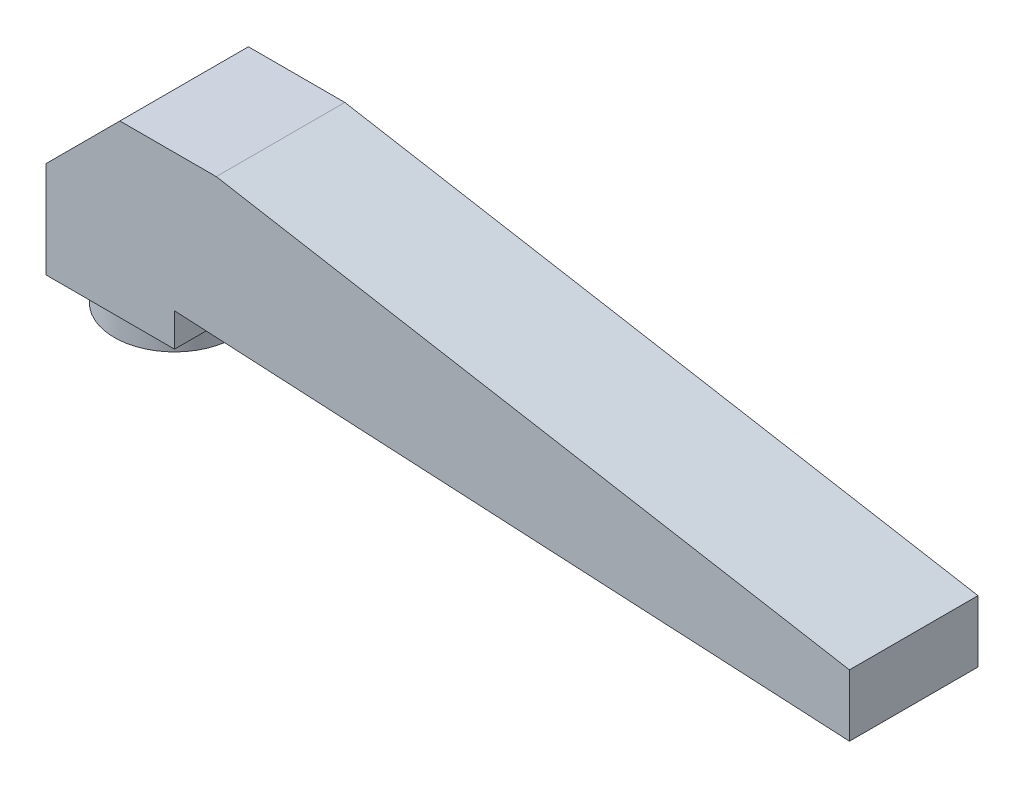
ISO-10303-21;
HEADER;
FILE_DESCRIPTION(('STEP AP214'),'2;1');
FILE_NAME('part.step','',(''),(''),'','','');
FILE_SCHEMA(('AUTOMOTIVE_DESIGN { 1 0 10303 214 1 1 1 1 }'));
ENDSEC;
DATA;
#1=APPLICATION_CONTEXT('core data for automotive mechanical design processes');
#2=APPLICATION_PROTOCOL_DEFINITION('international standard','automotive_design',2000,#1);
#3=PRODUCT_CONTEXT('',#1,'mechanical');
#4=PRODUCT('Part','Part','',(#3));
#5=PRODUCT_RELATED_PRODUCT_CATEGORY('part','',(#4));
#6=PRODUCT_DEFINITION_FORMATION('','',#4);
#7=PRODUCT_DEFINITION_CONTEXT('part definition',#1,'design');
#8=PRODUCT_DEFINITION('design','',#6,#7);
#9=PRODUCT_DEFINITION_SHAPE('','',#8);
#10=(LENGTH_UNIT() NAMED_UNIT(*) SI_UNIT(.MILLI.,.METRE.));
#11=(NAMED_UNIT(*) PLANE_ANGLE_UNIT() SI_UNIT($,.RADIAN.));
#12=(NAMED_UNIT(*) SI_UNIT($,.STERADIAN.) SOLID_ANGLE_UNIT());
#13=UNCERTAINTY_MEASURE_WITH_UNIT(LENGTH_MEASURE(1.E-05),#10,'distance_accuracy_value','');
#14=(GEOMETRIC_REPRESENTATION_CONTEXT(3) GLOBAL_UNCERTAINTY_ASSIGNED_CONTEXT((#13)) GLOBAL_UNIT_ASSIGNED_CONTEXT((#10,
#11,#12)) REPRESENTATION_CONTEXT('',''));
#15=CARTESIAN_POINT('',(0.,0.,0.));
#16=DIRECTION('',(0.,0.,1.));
#17=DIRECTION('',(1.,0.,0.));
#18=AXIS2_PLACEMENT_3D('',#15,#16,#17);
#19=CARTESIAN_POINT('',(40.,-15.,0.));
#20=DIRECTION('',(0.,1.,0.));
#21=DIRECTION('',(0.,0.,1.));
#22=AXIS2_PLACEMENT_3D('',#19,#20,#21);
#23=CYLINDRICAL_SURFACE('',#22,37.5);
#24=CARTESIAN_POINT('',(40.,-15.,0.));
#25=DIRECTION('',(0.,-1.,0.));
#26=DIRECTION('',(0.,0.,-1.));
#27=AXIS2_PLACEMENT_3D('',#24,#25,#26);
#28=CIRCLE('',#27,37.5);
#29=CARTESIAN_POINT('',(40.,-15.,-37.5));
#30=VERTEX_POINT('',#29);
#31=EDGE_CURVE('E11',#30,#30,#28,.T.);
#32=ORIENTED_EDGE('',*,*,#31,.F.);
#33=EDGE_LOOP('',(#32));
#34=FACE_BOUND('',#33,.T.);
#35=CARTESIAN_POINT('',(40.,0.,0.));
#36=DIRECTION('',(0.,-1.,0.));
#37=DIRECTION('',(0.,0.,-1.));
#38=AXIS2_PLACEMENT_3D('',#35,#36,#37);
#39=CIRCLE('',#38,37.5);
#40=CARTESIAN_POINT('',(40.,0.,-37.5));
#41=VERTEX_POINT('',#40);
#42=EDGE_CURVE('E52',#41,#41,#39,.T.);
#43=ORIENTED_EDGE('',*,*,#42,.T.);
#44=EDGE_LOOP('',(#43));
#45=FACE_BOUND('',#44,.T.);
#46=ADVANCED_FACE('F49',(#34,#45),#23,.T.);
#47=CARTESIAN_POINT('',(40.,-15.,0.));
#48=DIRECTION('',(0.,-1.,0.));
#49=DIRECTION('',(0.,0.,-1.));
#50=AXIS2_PLACEMENT_3D('',#47,#48,#49);
#51=PLANE('',#50);
#52=ORIENTED_EDGE('',*,*,#31,.T.);
#53=EDGE_LOOP('',(#52));
#54=FACE_BOUND('',#53,.T.);
#55=ADVANCED_FACE('F64',(#54),#51,.T.);
#56=CARTESIAN_POINT('',(40.,0.,0.));
#57=DIRECTION('',(0.,-1.,0.));
#58=DIRECTION('',(0.,0.,-1.));
#59=AXIS2_PLACEMENT_3D('',#56,#57,#58);
#60=PLANE('',#59);
#61=ORIENTED_EDGE('',*,*,#42,.F.);
#62=EDGE_LOOP('',(#61));
#63=FACE_BOUND('',#62,.T.);
#64=ADVANCED_FACE('F62',(#63),#60,.F.);
#65=CLOSED_SHELL('',(#46,#55,#64));
#66=MANIFOLD_SOLID_BREP('B2',#65);
#67=CARTESIAN_POINT('',(0.,0.,40.));
#68=DIRECTION('',(0.,1.,0.));
#69=DIRECTION('',(0.,0.,1.));
#70=AXIS2_PLACEMENT_3D('',#67,#68,#69);
#71=PLANE('',#70);
#72=DIRECTION('',(1.,0.,0.));
#73=VECTOR('',#72,1.);
#74=CARTESIAN_POINT('',(0.,0.,-40.));
#75=LINE('',#74,#73);
#76=CARTESIAN_POINT('',(0.,0.,-40.));
#77=VERTEX_POINT('',#76);
#78=CARTESIAN_POINT('',(80.,0.,-40.));
#79=VERTEX_POINT('',#78);
#80=EDGE_CURVE('E191',#77,#79,#75,.T.);
#81=ORIENTED_EDGE('',*,*,#80,.T.);
#82=DIRECTION('',(0.,0.,-1.));
#83=VECTOR('',#82,1.);
#84=CARTESIAN_POINT('',(80.,0.,40.));
#85=LINE('',#84,#83);
#86=CARTESIAN_POINT('',(80.,0.,40.));
#87=VERTEX_POINT('',#86);
#88=EDGE_CURVE('E47',#87,#79,#85,.T.);
#89=ORIENTED_EDGE('',*,*,#88,.F.);
#90=DIRECTION('',(1.,0.,0.));
#91=VECTOR('',#90,1.);
#92=CARTESIAN_POINT('',(0.,0.,40.));
#93=LINE('',#92,#91);
#94=CARTESIAN_POINT('',(0.,0.,40.));
#95=VERTEX_POINT('',#94);
#96=EDGE_CURVE('E213',#95,#87,#93,.T.);
#97=ORIENTED_EDGE('',*,*,#96,.F.);
#98=DIRECTION('',(0.,0.,-1.));
#99=VECTOR('',#98,1.);
#100=CARTESIAN_POINT('',(0.,0.,40.));
#101=LINE('',#100,#99);
#102=EDGE_CURVE('E187',#95,#77,#101,.T.);
#103=ORIENTED_EDGE('',*,*,#102,.T.);
#104=EDGE_LOOP('',(#81,#89,#97,#103));
#105=FACE_BOUND('',#104,.T.);
#106=ADVANCED_FACE('F90',(#105),#71,.F.);
#107=CARTESIAN_POINT('',(80.,0.,40.));
#108=DIRECTION('',(-1.,0.,0.));
#109=DIRECTION('',(0.,0.,1.));
#110=AXIS2_PLACEMENT_3D('',#107,#108,#109);
#111=PLANE('',#110);
#112=DIRECTION('',(0.,1.,0.));
#113=VECTOR('',#112,1.);
#114=CARTESIAN_POINT('',(80.,0.,-40.));
#115=LINE('',#114,#113);
#116=CARTESIAN_POINT('',(80.,20.6947972106434,-40.));
#117=VERTEX_POINT('',#116);
#118=EDGE_CURVE('E195',#79,#117,#115,.T.);
#119=ORIENTED_EDGE('',*,*,#118,.T.);
#120=DIRECTION('',(0.,0.,-1.));
#121=VECTOR('',#120,1.);
#122=CARTESIAN_POINT('',(80.,20.6947972106434,40.));
#123=LINE('',#122,#121);
#124=CARTESIAN_POINT('',(80.,20.6947972106434,40.));
#125=VERTEX_POINT('',#124);
#126=EDGE_CURVE('E99',#125,#117,#123,.T.);
#127=ORIENTED_EDGE('',*,*,#126,.F.);
#128=DIRECTION('',(0.,1.,0.));
#129=VECTOR('',#128,1.);
#130=CARTESIAN_POINT('',(80.,0.,40.));
#131=LINE('',#130,#129);
#132=EDGE_CURVE('E150',#87,#125,#131,.T.);
#133=ORIENTED_EDGE('',*,*,#132,.F.);
#134=ORIENTED_EDGE('',*,*,#88,.T.);
#135=EDGE_LOOP('',(#119,#127,#133,#134));
#136=FACE_BOUND('',#135,.T.);
#137=ADVANCED_FACE('F259',(#136),#111,.F.);
#138=CARTESIAN_POINT('',(80.,20.6947972106434,40.));
#139=DIRECTION('',(0.0523359562429474,0.998629534754574,0.));
#140=DIRECTION('',(-0.998629534754574,0.0523359562429474,0.));
#141=AXIS2_PLACEMENT_3D('',#138,#139,#140);
#142=PLANE('',#141);
#143=DIRECTION('',(0.998629534754574,-0.0523359562429474,0.));
#144=VECTOR('',#143,1.);
#145=CARTESIAN_POINT('',(80.,20.6947972106434,-40.));
#146=LINE('',#145,#144);
#147=CARTESIAN_POINT('',(500.,-1.31647008823537,-40.));
#148=VERTEX_POINT('',#147);
#149=EDGE_CURVE('E198',#117,#148,#146,.T.);
#150=ORIENTED_EDGE('',*,*,#149,.T.);
#151=DIRECTION('',(0.,0.,-1.));
#152=VECTOR('',#151,1.);
#153=CARTESIAN_POINT('',(500.,-1.31647008823537,40.));
#154=LINE('',#153,#152);
#155=CARTESIAN_POINT('',(500.,-1.31647008823537,40.));
#156=VERTEX_POINT('',#155);
#157=EDGE_CURVE('E224',#156,#148,#154,.T.);
#158=ORIENTED_EDGE('',*,*,#157,.F.);
#159=DIRECTION('',(0.998629534754574,-0.0523359562429474,0.));
#160=VECTOR('',#159,1.);
#161=CARTESIAN_POINT('',(80.,20.6947972106434,40.));
#162=LINE('',#161,#160);
#163=EDGE_CURVE('E234',#125,#156,#162,.T.);
#164=ORIENTED_EDGE('',*,*,#163,.F.);
#165=ORIENTED_EDGE('',*,*,#126,.T.);
#166=EDGE_LOOP('',(#150,#158,#164,#165));
#167=FACE_BOUND('',#166,.T.);
#168=ADVANCED_FACE('F232',(#167),#142,.F.);
#169=CARTESIAN_POINT('',(500.,37.1578138378904,40.));
#170=DIRECTION('',(-1.,0.,0.));
#171=DIRECTION('',(0.,-1.,0.));
#172=AXIS2_PLACEMENT_3D('',#169,#170,#171);
#173=PLANE('',#172);
#174=DIRECTION('',(0.,1.,0.));
#175=VECTOR('',#174,1.);
#176=CARTESIAN_POINT('',(500.,37.1578138378904,-40.));
#177=LINE('',#176,#175);
#178=CARTESIAN_POINT('',(500.,37.1578138378904,-40.));
#179=VERTEX_POINT('',#178);
#180=EDGE_CURVE('E201',#148,#179,#177,.T.);
#181=ORIENTED_EDGE('',*,*,#180,.T.);
#182=DIRECTION('',(0.,0.,-1.));
#183=VECTOR('',#182,1.);
#184=CARTESIAN_POINT('',(500.,37.1578138378904,40.));
#185=LINE('',#184,#183);
#186=CARTESIAN_POINT('',(500.,37.1578138378904,40.));
#187=VERTEX_POINT('',#186);
#188=EDGE_CURVE('E220',#187,#179,#185,.T.);
#189=ORIENTED_EDGE('',*,*,#188,.F.);
#190=DIRECTION('',(0.,1.,0.));
#191=VECTOR('',#190,1.);
#192=CARTESIAN_POINT('',(500.,37.1578138378904,40.));
#193=LINE('',#192,#191);
#194=EDGE_CURVE('E247',#156,#187,#193,.T.);
#195=ORIENTED_EDGE('',*,*,#194,.F.);
#196=ORIENTED_EDGE('',*,*,#157,.T.);
#197=EDGE_LOOP('',(#181,#189,#195,#196));
#198=FACE_BOUND('',#197,.T.);
#199=ADVANCED_FACE('F242',(#198),#173,.F.);
#200=CARTESIAN_POINT('',(105.961940777125,105.961940777126,40.));
#201=DIRECTION('',(-0.172010317348089,-0.985095148057186,0.));
#202=DIRECTION('',(0.985095148057186,-0.172010317348089,0.));
#203=AXIS2_PLACEMENT_3D('',#200,#201,#202);
#204=PLANE('',#203);
#205=DIRECTION('',(-0.985095148057186,0.172010317348089,0.));
#206=VECTOR('',#205,1.);
#207=CARTESIAN_POINT('',(105.961940777125,105.961940777126,-40.));
#208=LINE('',#207,#206);
#209=CARTESIAN_POINT('',(105.961940777125,105.961940777126,-40.));
#210=VERTEX_POINT('',#209);
#211=EDGE_CURVE('E204',#179,#210,#208,.T.);
#212=ORIENTED_EDGE('',*,*,#211,.T.);
#213=DIRECTION('',(0.,0.,-1.));
#214=VECTOR('',#213,1.);
#215=CARTESIAN_POINT('',(105.961940777125,105.961940777126,40.));
#216=LINE('',#215,#214);
#217=CARTESIAN_POINT('',(105.961940777125,105.961940777126,40.));
#218=VERTEX_POINT('',#217);
#219=EDGE_CURVE('E180',#218,#210,#216,.T.);
#220=ORIENTED_EDGE('',*,*,#219,.F.);
#221=DIRECTION('',(-0.985095148057186,0.172010317348089,0.));
#222=VECTOR('',#221,1.);
#223=CARTESIAN_POINT('',(105.961940777125,105.961940777126,40.));
#224=LINE('',#223,#222);
#225=EDGE_CURVE('E169',#187,#218,#224,.T.);
#226=ORIENTED_EDGE('',*,*,#225,.F.);
#227=ORIENTED_EDGE('',*,*,#188,.T.);
#228=EDGE_LOOP('',(#212,#220,#226,#227));
#229=FACE_BOUND('',#228,.T.);
#230=ADVANCED_FACE('F245',(#229),#204,.F.);
#231=CARTESIAN_POINT('',(45.9619407771253,105.961940777126,40.));
#232=DIRECTION('',(0.,-1.,0.));
#233=DIRECTION('',(0.,0.,-1.));
#234=AXIS2_PLACEMENT_3D('',#231,#232,#233);
#235=PLANE('',#234);
#236=DIRECTION('',(-1.,0.,0.));
#237=VECTOR('',#236,1.);
#238=CARTESIAN_POINT('',(45.9619407771253,105.961940777126,-40.));
#239=LINE('',#238,#237);
#240=CARTESIAN_POINT('',(45.9619407771253,105.961940777126,-40.));
#241=VERTEX_POINT('',#240);
#242=EDGE_CURVE('E178',#210,#241,#239,.T.);
#243=ORIENTED_EDGE('',*,*,#242,.T.);
#244=DIRECTION('',(0.,0.,-1.));
#245=VECTOR('',#244,1.);
#246=CARTESIAN_POINT('',(45.9619407771253,105.961940777126,40.));
#247=LINE('',#246,#245);
#248=CARTESIAN_POINT('',(45.9619407771253,105.961940777126,40.));
#249=VERTEX_POINT('',#248);
#250=EDGE_CURVE('E175',#249,#241,#247,.T.);
#251=ORIENTED_EDGE('',*,*,#250,.F.);
#252=DIRECTION('',(-1.,0.,0.));
#253=VECTOR('',#252,1.);
#254=CARTESIAN_POINT('',(45.9619407771253,105.961940777126,40.));
#255=LINE('',#254,#253);
#256=EDGE_CURVE('E163',#218,#249,#255,.T.);
#257=ORIENTED_EDGE('',*,*,#256,.F.);
#258=ORIENTED_EDGE('',*,*,#219,.T.);
#259=EDGE_LOOP('',(#243,#251,#257,#258));
#260=FACE_BOUND('',#259,.T.);
#261=ADVANCED_FACE('F176',(#260),#235,.F.);
#262=CARTESIAN_POINT('',(0.,60.,40.));
#263=DIRECTION('',(0.707106781186552,-0.707106781186543,0.));
#264=DIRECTION('',(0.707106781186543,0.707106781186552,0.));
#265=AXIS2_PLACEMENT_3D('',#262,#263,#264);
#266=PLANE('',#265);
#267=DIRECTION('',(-0.707106781186543,-0.707106781186552,0.));
#268=VECTOR('',#267,1.);
#269=CARTESIAN_POINT('',(0.,60.,-40.));
#270=LINE('',#269,#268);
#271=CARTESIAN_POINT('',(0.,60.,-40.));
#272=VERTEX_POINT('',#271);
#273=EDGE_CURVE('E136',#241,#272,#270,.T.);
#274=ORIENTED_EDGE('',*,*,#273,.T.);
#275=DIRECTION('',(0.,0.,-1.));
#276=VECTOR('',#275,1.);
#277=CARTESIAN_POINT('',(0.,60.,40.));
#278=LINE('',#277,#276);
#279=CARTESIAN_POINT('',(0.,60.,40.));
#280=VERTEX_POINT('',#279);
#281=EDGE_CURVE('E181',#280,#272,#278,.T.);
#282=ORIENTED_EDGE('',*,*,#281,.F.);
#283=DIRECTION('',(-0.707106781186543,-0.707106781186552,0.));
#284=VECTOR('',#283,1.);
#285=CARTESIAN_POINT('',(0.,60.,40.));
#286=LINE('',#285,#284);
#287=EDGE_CURVE('E167',#249,#280,#286,.T.);
#288=ORIENTED_EDGE('',*,*,#287,.F.);
#289=ORIENTED_EDGE('',*,*,#250,.T.);
#290=EDGE_LOOP('',(#274,#282,#288,#289));
#291=FACE_BOUND('',#290,.T.);
#292=ADVANCED_FACE('F183',(#291),#266,.F.);
#293=CARTESIAN_POINT('',(0.,0.,40.));
#294=DIRECTION('',(1.,0.,0.));
#295=DIRECTION('',(0.,1.,0.));
#296=AXIS2_PLACEMENT_3D('',#293,#294,#295);
#297=PLANE('',#296);
#298=DIRECTION('',(0.,-1.,0.));
#299=VECTOR('',#298,1.);
#300=CARTESIAN_POINT('',(0.,0.,-40.));
#301=LINE('',#300,#299);
#302=EDGE_CURVE('E142',#272,#77,#301,.T.);
#303=ORIENTED_EDGE('',*,*,#302,.T.);
#304=ORIENTED_EDGE('',*,*,#102,.F.);
#305=DIRECTION('',(0.,-1.,0.));
#306=VECTOR('',#305,1.);
#307=CARTESIAN_POINT('',(0.,0.,40.));
#308=LINE('',#307,#306);
#309=EDGE_CURVE('E107',#280,#95,#308,.T.);
#310=ORIENTED_EDGE('',*,*,#309,.F.);
#311=ORIENTED_EDGE('',*,*,#281,.T.);
#312=EDGE_LOOP('',(#303,#304,#310,#311));
#313=FACE_BOUND('',#312,.T.);
#314=ADVANCED_FACE('F275',(#313),#297,.F.);
#315=CARTESIAN_POINT('',(0.,0.,40.));
#316=DIRECTION('',(0.,0.,1.));
#317=DIRECTION('',(1.,0.,0.));
#318=AXIS2_PLACEMENT_3D('',#315,#316,#317);
#319=PLANE('',#318);
#320=ORIENTED_EDGE('',*,*,#96,.T.);
#321=ORIENTED_EDGE('',*,*,#132,.T.);
#322=ORIENTED_EDGE('',*,*,#163,.T.);
#323=ORIENTED_EDGE('',*,*,#194,.T.);
#324=ORIENTED_EDGE('',*,*,#225,.T.);
#325=ORIENTED_EDGE('',*,*,#256,.T.);
#326=ORIENTED_EDGE('',*,*,#287,.T.);
#327=ORIENTED_EDGE('',*,*,#309,.T.);
#328=EDGE_LOOP('',(#320,#321,#322,#323,#324,#325,#326,#327));
#329=FACE_BOUND('',#328,.T.);
#330=ADVANCED_FACE('F165',(#329),#319,.T.);
#331=CARTESIAN_POINT('',(0.,0.,-40.));
#332=DIRECTION('',(0.,0.,1.));
#333=DIRECTION('',(1.,0.,0.));
#334=AXIS2_PLACEMENT_3D('',#331,#332,#333);
#335=PLANE('',#334);
#336=ORIENTED_EDGE('',*,*,#80,.F.);
#337=ORIENTED_EDGE('',*,*,#302,.F.);
#338=ORIENTED_EDGE('',*,*,#273,.F.);
#339=ORIENTED_EDGE('',*,*,#242,.F.);
#340=ORIENTED_EDGE('',*,*,#211,.F.);
#341=ORIENTED_EDGE('',*,*,#180,.F.);
#342=ORIENTED_EDGE('',*,*,#149,.F.);
#343=ORIENTED_EDGE('',*,*,#118,.F.);
#344=EDGE_LOOP('',(#336,#337,#338,#339,#340,#341,#342,#343));
#345=FACE_BOUND('',#344,.T.);
#346=ADVANCED_FACE('F238',(#345),#335,.F.);
#347=CLOSED_SHELL('',(#106,#137,#168,#199,#230,#261,#292,#314,#330,#346));
#348=MANIFOLD_SOLID_BREP('B6',#347);
#349=ADVANCED_BREP_SHAPE_REPRESENTATION('',(#18,#66,#348),#14);
#350=SHAPE_DEFINITION_REPRESENTATION(#9,#349);
ENDSEC;
END-ISO-10303-21;
